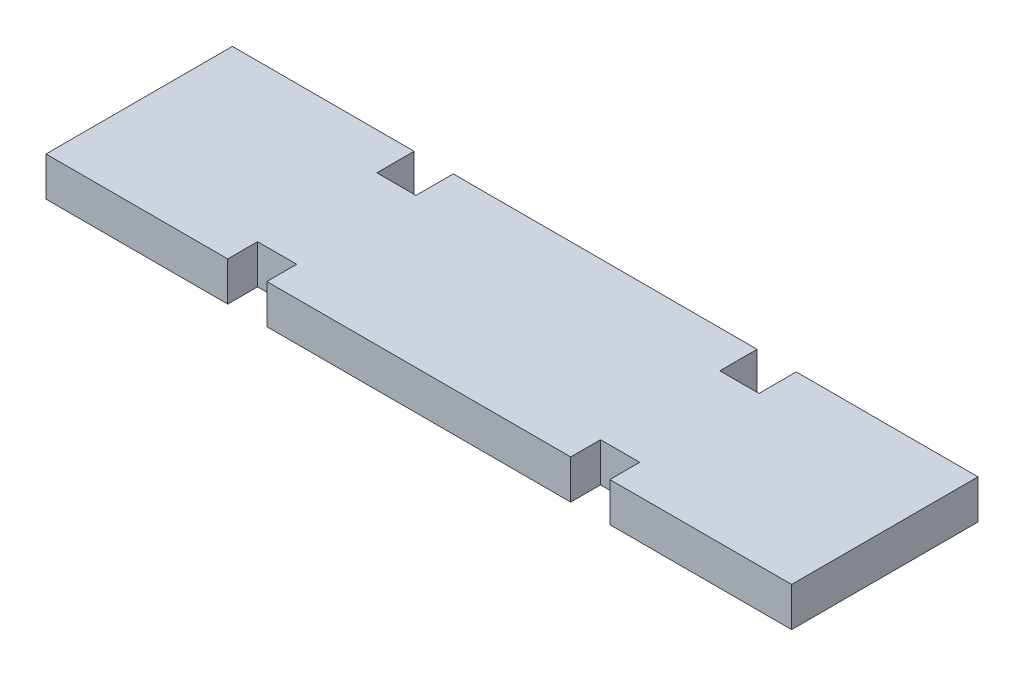
ISO-10303-21;
HEADER;
FILE_DESCRIPTION(('STEP AP214'),'2;1');
FILE_NAME('part.step','',(''),(''),'','','');
FILE_SCHEMA(('AUTOMOTIVE_DESIGN { 1 0 10303 214 1 1 1 1 }'));
ENDSEC;
DATA;
#1=APPLICATION_CONTEXT('core data for automotive mechanical design processes');
#2=APPLICATION_PROTOCOL_DEFINITION('international standard','automotive_design',2000,#1);
#3=PRODUCT_CONTEXT('',#1,'mechanical');
#4=PRODUCT('Part','Part','',(#3));
#5=PRODUCT_RELATED_PRODUCT_CATEGORY('part','',(#4));
#6=PRODUCT_DEFINITION_FORMATION('','',#4);
#7=PRODUCT_DEFINITION_CONTEXT('part definition',#1,'design');
#8=PRODUCT_DEFINITION('design','',#6,#7);
#9=PRODUCT_DEFINITION_SHAPE('','',#8);
#10=(LENGTH_UNIT() NAMED_UNIT(*) SI_UNIT(.MILLI.,.METRE.));
#11=(NAMED_UNIT(*) PLANE_ANGLE_UNIT() SI_UNIT($,.RADIAN.));
#12=(NAMED_UNIT(*) SI_UNIT($,.STERADIAN.) SOLID_ANGLE_UNIT());
#13=UNCERTAINTY_MEASURE_WITH_UNIT(LENGTH_MEASURE(1.E-05),#10,'distance_accuracy_value','');
#14=(GEOMETRIC_REPRESENTATION_CONTEXT(3) GLOBAL_UNCERTAINTY_ASSIGNED_CONTEXT((#13)) GLOBAL_UNIT_ASSIGNED_CONTEXT((#10,
#11,#12)) REPRESENTATION_CONTEXT('',''));
#15=CARTESIAN_POINT('',(0.,0.,0.));
#16=DIRECTION('',(0.,0.,1.));
#17=DIRECTION('',(1.,0.,0.));
#18=AXIS2_PLACEMENT_3D('',#15,#16,#17);
#19=CARTESIAN_POINT('',(-61.4443732272423,5.334,-32.8730043975415));
#20=DIRECTION('',(0.,0.,1.));
#21=DIRECTION('',(1.,0.,0.));
#22=AXIS2_PLACEMENT_3D('',#19,#20,#21);
#23=PLANE('',#22);
#24=DIRECTION('',(-1.,0.,0.));
#25=VECTOR('',#24,1.);
#26=CARTESIAN_POINT('',(-61.4443732272423,0.,-32.8730043975415));
#27=LINE('',#26,#25);
#28=CARTESIAN_POINT('',(10.0566267727577,0.,-32.8730043975415));
#29=VERTEX_POINT('',#28);
#30=CARTESIAN_POINT('',(-31.3453732272423,0.,-32.8730043975415));
#31=VERTEX_POINT('',#30);
#32=EDGE_CURVE('E193',#29,#31,#27,.T.);
#33=ORIENTED_EDGE('',*,*,#32,.T.);
#34=DIRECTION('',(0.,1.,0.));
#35=VECTOR('',#34,1.);
#36=CARTESIAN_POINT('',(-31.3453732272423,0.,-32.8730043975415));
#37=LINE('',#36,#35);
#38=CARTESIAN_POINT('',(-31.3453732272423,5.334,-32.8730043975415));
#39=VERTEX_POINT('',#38);
#40=EDGE_CURVE('E344',#31,#39,#37,.T.);
#41=ORIENTED_EDGE('',*,*,#40,.T.);
#42=DIRECTION('',(-1.,0.,0.));
#43=VECTOR('',#42,1.);
#44=CARTESIAN_POINT('',(-61.4443732272423,5.334,-32.8730043975415));
#45=LINE('',#44,#43);
#46=CARTESIAN_POINT('',(10.0566267727577,5.334,-32.8730043975415));
#47=VERTEX_POINT('',#46);
#48=EDGE_CURVE('E227',#47,#39,#45,.T.);
#49=ORIENTED_EDGE('',*,*,#48,.F.);
#50=DIRECTION('',(0.,1.,0.));
#51=VECTOR('',#50,1.);
#52=CARTESIAN_POINT('',(10.0566267727577,0.,-32.8730043975415));
#53=LINE('',#52,#51);
#54=EDGE_CURVE('E230',#29,#47,#53,.T.);
#55=ORIENTED_EDGE('',*,*,#54,.F.);
#56=EDGE_LOOP('',(#33,#41,#49,#55));
#57=FACE_BOUND('',#56,.T.);
#58=ADVANCED_FACE('F33',(#57),#23,.F.);
#59=CARTESIAN_POINT('',(-61.4443732272423,5.334,-7.4730043975415));
#60=DIRECTION('',(0.,0.,-1.));
#61=DIRECTION('',(-1.,0.,0.));
#62=AXIS2_PLACEMENT_3D('',#59,#60,#61);
#63=PLANE('',#62);
#64=DIRECTION('',(1.,0.,0.));
#65=VECTOR('',#64,1.);
#66=CARTESIAN_POINT('',(-61.4443732272423,0.,-7.4730043975415));
#67=LINE('',#66,#65);
#68=CARTESIAN_POINT('',(-61.4443732272423,0.,-7.4730043975415));
#69=VERTEX_POINT('',#68);
#70=CARTESIAN_POINT('',(-36.6793732272423,0.,-7.4730043975415));
#71=VERTEX_POINT('',#70);
#72=EDGE_CURVE('E198',#69,#71,#67,.T.);
#73=ORIENTED_EDGE('',*,*,#72,.T.);
#74=DIRECTION('',(0.,1.,0.));
#75=VECTOR('',#74,1.);
#76=CARTESIAN_POINT('',(-36.6793732272423,0.,-7.4730043975415));
#77=LINE('',#76,#75);
#78=CARTESIAN_POINT('',(-36.6793732272423,5.334,-7.4730043975415));
#79=VERTEX_POINT('',#78);
#80=EDGE_CURVE('E288',#71,#79,#77,.T.);
#81=ORIENTED_EDGE('',*,*,#80,.T.);
#82=DIRECTION('',(1.,0.,0.));
#83=VECTOR('',#82,1.);
#84=CARTESIAN_POINT('',(-61.4443732272423,5.334,-7.4730043975415));
#85=LINE('',#84,#83);
#86=CARTESIAN_POINT('',(-61.4443732272423,5.334,-7.4730043975415));
#87=VERTEX_POINT('',#86);
#88=EDGE_CURVE('E216',#87,#79,#85,.T.);
#89=ORIENTED_EDGE('',*,*,#88,.F.);
#90=DIRECTION('',(0.,-1.,0.));
#91=VECTOR('',#90,1.);
#92=CARTESIAN_POINT('',(-61.4443732272423,5.334,-7.4730043975415));
#93=LINE('',#92,#91);
#94=EDGE_CURVE('E11',#87,#69,#93,.T.);
#95=ORIENTED_EDGE('',*,*,#94,.T.);
#96=EDGE_LOOP('',(#73,#81,#89,#95));
#97=FACE_BOUND('',#96,.T.);
#98=ADVANCED_FACE('F287',(#97),#63,.F.);
#99=CARTESIAN_POINT('',(-31.3453732272423,5.334,-7.4730043975415));
#100=VERTEX_POINT('',#99);
#101=CARTESIAN_POINT('',(10.0566267727577,5.334,-7.4730043975415));
#102=VERTEX_POINT('',#101);
#103=EDGE_CURVE('E214',#100,#102,#85,.T.);
#104=ORIENTED_EDGE('',*,*,#103,.F.);
#105=DIRECTION('',(0.,1.,0.));
#106=VECTOR('',#105,1.);
#107=CARTESIAN_POINT('',(-31.3453732272423,0.,-7.4730043975415));
#108=LINE('',#107,#106);
#109=CARTESIAN_POINT('',(-31.3453732272423,0.,-7.4730043975415));
#110=VERTEX_POINT('',#109);
#111=EDGE_CURVE('E310',#110,#100,#108,.T.);
#112=ORIENTED_EDGE('',*,*,#111,.F.);
#113=CARTESIAN_POINT('',(10.0566267727577,0.,-7.4730043975415));
#114=VERTEX_POINT('',#113);
#115=EDGE_CURVE('E232',#110,#114,#67,.T.);
#116=ORIENTED_EDGE('',*,*,#115,.T.);
#117=DIRECTION('',(0.,1.,0.));
#118=VECTOR('',#117,1.);
#119=CARTESIAN_POINT('',(10.0566267727577,0.,-7.4730043975415));
#120=LINE('',#119,#118);
#121=EDGE_CURVE('E322',#114,#102,#120,.T.);
#122=ORIENTED_EDGE('',*,*,#121,.T.);
#123=EDGE_LOOP('',(#104,#112,#116,#122));
#124=FACE_BOUND('',#123,.T.);
#125=ADVANCED_FACE('F368',(#124),#63,.F.);
#126=CARTESIAN_POINT('',(-36.6793732272423,5.334,-32.8730043975415));
#127=VERTEX_POINT('',#126);
#128=CARTESIAN_POINT('',(-61.4443732272423,5.334,-32.8730043975415));
#129=VERTEX_POINT('',#128);
#130=EDGE_CURVE('E186',#127,#129,#45,.T.);
#131=ORIENTED_EDGE('',*,*,#130,.F.);
#132=DIRECTION('',(0.,1.,0.));
#133=VECTOR('',#132,1.);
#134=CARTESIAN_POINT('',(-36.6793732272423,0.,-32.8730043975415));
#135=LINE('',#134,#133);
#136=CARTESIAN_POINT('',(-36.6793732272423,0.,-32.8730043975415));
#137=VERTEX_POINT('',#136);
#138=EDGE_CURVE('E173',#137,#127,#135,.T.);
#139=ORIENTED_EDGE('',*,*,#138,.F.);
#140=CARTESIAN_POINT('',(-61.4443732272423,0.,-32.8730043975415));
#141=VERTEX_POINT('',#140);
#142=EDGE_CURVE('E184',#137,#141,#27,.T.);
#143=ORIENTED_EDGE('',*,*,#142,.T.);
#144=DIRECTION('',(0.,-1.,0.));
#145=VECTOR('',#144,1.);
#146=CARTESIAN_POINT('',(-61.4443732272423,5.334,-32.8730043975415));
#147=LINE('',#146,#145);
#148=EDGE_CURVE('E226',#129,#141,#147,.T.);
#149=ORIENTED_EDGE('',*,*,#148,.F.);
#150=EDGE_LOOP('',(#131,#139,#143,#149));
#151=FACE_BOUND('',#150,.T.);
#152=ADVANCED_FACE('F182',(#151),#23,.F.);
#153=CARTESIAN_POINT('',(-61.4443732272423,5.334,-32.8730043975415));
#154=DIRECTION('',(1.,0.,0.));
#155=DIRECTION('',(0.,0.,-1.));
#156=AXIS2_PLACEMENT_3D('',#153,#154,#155);
#157=PLANE('',#156);
#158=DIRECTION('',(0.,0.,1.));
#159=VECTOR('',#158,1.);
#160=CARTESIAN_POINT('',(-61.4443732272423,0.,-32.8730043975415));
#161=LINE('',#160,#159);
#162=EDGE_CURVE('E192',#141,#69,#161,.T.);
#163=ORIENTED_EDGE('',*,*,#162,.T.);
#164=ORIENTED_EDGE('',*,*,#94,.F.);
#165=DIRECTION('',(0.,0.,1.));
#166=VECTOR('',#165,1.);
#167=CARTESIAN_POINT('',(-61.4443732272423,5.334,-32.8730043975415));
#168=LINE('',#167,#166);
#169=EDGE_CURVE('E202',#129,#87,#168,.T.);
#170=ORIENTED_EDGE('',*,*,#169,.F.);
#171=ORIENTED_EDGE('',*,*,#148,.T.);
#172=EDGE_LOOP('',(#163,#164,#170,#171));
#173=FACE_BOUND('',#172,.T.);
#174=ADVANCED_FACE('F35',(#173),#157,.F.);
#175=CARTESIAN_POINT('',(15.3906267727577,5.334,-7.4730043975415));
#176=VERTEX_POINT('',#175);
#177=CARTESIAN_POINT('',(40.1556267727577,5.334,-7.4730043975415));
#178=VERTEX_POINT('',#177);
#179=EDGE_CURVE('E208',#176,#178,#85,.T.);
#180=ORIENTED_EDGE('',*,*,#179,.F.);
#181=DIRECTION('',(0.,1.,0.));
#182=VECTOR('',#181,1.);
#183=CARTESIAN_POINT('',(15.3906267727577,0.,-7.4730043975415));
#184=LINE('',#183,#182);
#185=CARTESIAN_POINT('',(15.3906267727577,0.,-7.4730043975415));
#186=VERTEX_POINT('',#185);
#187=EDGE_CURVE('E243',#186,#176,#184,.T.);
#188=ORIENTED_EDGE('',*,*,#187,.F.);
#189=CARTESIAN_POINT('',(40.1556267727577,0.,-7.4730043975415));
#190=VERTEX_POINT('',#189);
#191=EDGE_CURVE('E229',#186,#190,#67,.T.);
#192=ORIENTED_EDGE('',*,*,#191,.T.);
#193=DIRECTION('',(0.,-1.,0.));
#194=VECTOR('',#193,1.);
#195=CARTESIAN_POINT('',(40.1556267727577,5.334,-7.4730043975415));
#196=LINE('',#195,#194);
#197=EDGE_CURVE('E41',#178,#190,#196,.T.);
#198=ORIENTED_EDGE('',*,*,#197,.F.);
#199=EDGE_LOOP('',(#180,#188,#192,#198));
#200=FACE_BOUND('',#199,.T.);
#201=ADVANCED_FACE('F241',(#200),#63,.F.);
#202=CARTESIAN_POINT('',(40.1556267727577,5.334,-32.8730043975415));
#203=DIRECTION('',(-1.,0.,0.));
#204=DIRECTION('',(0.,0.,1.));
#205=AXIS2_PLACEMENT_3D('',#202,#203,#204);
#206=PLANE('',#205);
#207=DIRECTION('',(0.,0.,-1.));
#208=VECTOR('',#207,1.);
#209=CARTESIAN_POINT('',(40.1556267727577,0.,-32.8730043975415));
#210=LINE('',#209,#208);
#211=CARTESIAN_POINT('',(40.1556267727577,0.,-32.8730043975415));
#212=VERTEX_POINT('',#211);
#213=EDGE_CURVE('E194',#190,#212,#210,.T.);
#214=ORIENTED_EDGE('',*,*,#213,.T.);
#215=DIRECTION('',(0.,-1.,0.));
#216=VECTOR('',#215,1.);
#217=CARTESIAN_POINT('',(40.1556267727577,5.334,-32.8730043975415));
#218=LINE('',#217,#216);
#219=CARTESIAN_POINT('',(40.1556267727577,5.334,-32.8730043975415));
#220=VERTEX_POINT('',#219);
#221=EDGE_CURVE('E249',#220,#212,#218,.T.);
#222=ORIENTED_EDGE('',*,*,#221,.F.);
#223=DIRECTION('',(0.,0.,-1.));
#224=VECTOR('',#223,1.);
#225=CARTESIAN_POINT('',(40.1556267727577,5.334,-32.8730043975415));
#226=LINE('',#225,#224);
#227=EDGE_CURVE('E221',#178,#220,#226,.T.);
#228=ORIENTED_EDGE('',*,*,#227,.F.);
#229=ORIENTED_EDGE('',*,*,#197,.T.);
#230=EDGE_LOOP('',(#214,#222,#228,#229));
#231=FACE_BOUND('',#230,.T.);
#232=ADVANCED_FACE('F247',(#231),#206,.F.);
#233=CARTESIAN_POINT('',(15.3906267727577,0.,-32.8730043975415));
#234=VERTEX_POINT('',#233);
#235=EDGE_CURVE('E196',#212,#234,#27,.T.);
#236=ORIENTED_EDGE('',*,*,#235,.T.);
#237=DIRECTION('',(0.,1.,0.));
#238=VECTOR('',#237,1.);
#239=CARTESIAN_POINT('',(15.3906267727577,0.,-32.8730043975415));
#240=LINE('',#239,#238);
#241=CARTESIAN_POINT('',(15.3906267727577,5.334,-32.8730043975415));
#242=VERTEX_POINT('',#241);
#243=EDGE_CURVE('E274',#234,#242,#240,.T.);
#244=ORIENTED_EDGE('',*,*,#243,.T.);
#245=EDGE_CURVE('E223',#220,#242,#45,.T.);
#246=ORIENTED_EDGE('',*,*,#245,.F.);
#247=ORIENTED_EDGE('',*,*,#221,.T.);
#248=EDGE_LOOP('',(#236,#244,#246,#247));
#249=FACE_BOUND('',#248,.T.);
#250=ADVANCED_FACE('F284',(#249),#23,.F.);
#251=CARTESIAN_POINT('',(0.,5.334,0.));
#252=DIRECTION('',(0.,1.,0.));
#253=DIRECTION('',(0.,0.,1.));
#254=AXIS2_PLACEMENT_3D('',#251,#252,#253);
#255=PLANE('',#254);
#256=DIRECTION('',(0.,0.,-1.));
#257=VECTOR('',#256,1.);
#258=CARTESIAN_POINT('',(-31.3453732272423,5.334,-32.8730043975415));
#259=LINE('',#258,#257);
#260=CARTESIAN_POINT('',(-31.3453732272423,5.334,-27.7930043975415));
#261=VERTEX_POINT('',#260);
#262=EDGE_CURVE('E178',#261,#39,#259,.T.);
#263=ORIENTED_EDGE('',*,*,#262,.F.);
#264=DIRECTION('',(1.,0.,0.));
#265=VECTOR('',#264,1.);
#266=CARTESIAN_POINT('',(-31.3453732272423,5.334,-27.7930043975415));
#267=LINE('',#266,#265);
#268=CARTESIAN_POINT('',(-36.6793732272423,5.334,-27.7930043975415));
#269=VERTEX_POINT('',#268);
#270=EDGE_CURVE('E348',#269,#261,#267,.T.);
#271=ORIENTED_EDGE('',*,*,#270,.F.);
#272=DIRECTION('',(0.,0.,1.));
#273=VECTOR('',#272,1.);
#274=CARTESIAN_POINT('',(-36.6793732272423,5.334,-32.8730043975415));
#275=LINE('',#274,#273);
#276=EDGE_CURVE('E346',#127,#269,#275,.T.);
#277=ORIENTED_EDGE('',*,*,#276,.F.);
#278=ORIENTED_EDGE('',*,*,#130,.T.);
#279=ORIENTED_EDGE('',*,*,#169,.T.);
#280=ORIENTED_EDGE('',*,*,#88,.T.);
#281=DIRECTION('',(0.,0.,1.));
#282=VECTOR('',#281,1.);
#283=CARTESIAN_POINT('',(-36.6793732272423,5.334,-7.4730043975415));
#284=LINE('',#283,#282);
#285=CARTESIAN_POINT('',(-36.6793732272423,5.334,-11.5370043975415));
#286=VERTEX_POINT('',#285);
#287=EDGE_CURVE('E291',#286,#79,#284,.T.);
#288=ORIENTED_EDGE('',*,*,#287,.F.);
#289=DIRECTION('',(-1.,0.,0.));
#290=VECTOR('',#289,1.);
#291=CARTESIAN_POINT('',(-31.3453732272423,5.334,-11.5370043975415));
#292=LINE('',#291,#290);
#293=CARTESIAN_POINT('',(-31.3453732272423,5.334,-11.5370043975415));
#294=VERTEX_POINT('',#293);
#295=EDGE_CURVE('E294',#294,#286,#292,.T.);
#296=ORIENTED_EDGE('',*,*,#295,.F.);
#297=DIRECTION('',(0.,0.,-1.));
#298=VECTOR('',#297,1.);
#299=CARTESIAN_POINT('',(-31.3453732272423,5.334,-7.4730043975415));
#300=LINE('',#299,#298);
#301=EDGE_CURVE('E300',#100,#294,#300,.T.);
#302=ORIENTED_EDGE('',*,*,#301,.F.);
#303=ORIENTED_EDGE('',*,*,#103,.T.);
#304=DIRECTION('',(0.,0.,1.));
#305=VECTOR('',#304,1.);
#306=CARTESIAN_POINT('',(10.0566267727577,5.334,-7.4730043975415));
#307=LINE('',#306,#305);
#308=CARTESIAN_POINT('',(10.0566267727577,5.334,-11.5370043975415));
#309=VERTEX_POINT('',#308);
#310=EDGE_CURVE('E305',#309,#102,#307,.T.);
#311=ORIENTED_EDGE('',*,*,#310,.F.);
#312=DIRECTION('',(-1.,0.,0.));
#313=VECTOR('',#312,1.);
#314=CARTESIAN_POINT('',(10.0566267727577,5.334,-11.5370043975415));
#315=LINE('',#314,#313);
#316=CARTESIAN_POINT('',(15.3906267727577,5.334,-11.5370043975415));
#317=VERTEX_POINT('',#316);
#318=EDGE_CURVE('E317',#317,#309,#315,.T.);
#319=ORIENTED_EDGE('',*,*,#318,.F.);
#320=DIRECTION('',(0.,0.,-1.));
#321=VECTOR('',#320,1.);
#322=CARTESIAN_POINT('',(15.3906267727577,5.334,-7.4730043975415));
#323=LINE('',#322,#321);
#324=EDGE_CURVE('E325',#176,#317,#323,.T.);
#325=ORIENTED_EDGE('',*,*,#324,.F.);
#326=ORIENTED_EDGE('',*,*,#179,.T.);
#327=ORIENTED_EDGE('',*,*,#227,.T.);
#328=ORIENTED_EDGE('',*,*,#245,.T.);
#329=DIRECTION('',(0.,0.,-1.));
#330=VECTOR('',#329,1.);
#331=CARTESIAN_POINT('',(15.3906267727577,5.334,-32.8730043975415));
#332=LINE('',#331,#330);
#333=CARTESIAN_POINT('',(15.3906267727577,5.334,-27.7930043975415));
#334=VERTEX_POINT('',#333);
#335=EDGE_CURVE('E271',#334,#242,#332,.T.);
#336=ORIENTED_EDGE('',*,*,#335,.F.);
#337=DIRECTION('',(1.,0.,0.));
#338=VECTOR('',#337,1.);
#339=CARTESIAN_POINT('',(10.0566267727577,5.334,-27.7930043975415));
#340=LINE('',#339,#338);
#341=CARTESIAN_POINT('',(10.0566267727577,5.334,-27.7930043975415));
#342=VERTEX_POINT('',#341);
#343=EDGE_CURVE('E267',#342,#334,#340,.T.);
#344=ORIENTED_EDGE('',*,*,#343,.F.);
#345=DIRECTION('',(0.,0.,1.));
#346=VECTOR('',#345,1.);
#347=CARTESIAN_POINT('',(10.0566267727577,5.334,-32.8730043975415));
#348=LINE('',#347,#346);
#349=EDGE_CURVE('E264',#47,#342,#348,.T.);
#350=ORIENTED_EDGE('',*,*,#349,.F.);
#351=ORIENTED_EDGE('',*,*,#48,.T.);
#352=EDGE_LOOP('',(#263,#271,#277,#278,#279,#280,#288,#296,#302,#303,#311,#319,#325,#326,#327,
#328,#336,#344,#350,#351));
#353=FACE_BOUND('',#352,.T.);
#354=ADVANCED_FACE('F282',(#353),#255,.T.);
#355=CARTESIAN_POINT('',(0.,0.,0.));
#356=DIRECTION('',(0.,1.,0.));
#357=DIRECTION('',(0.,0.,1.));
#358=AXIS2_PLACEMENT_3D('',#355,#356,#357);
#359=PLANE('',#358);
#360=DIRECTION('',(1.,0.,0.));
#361=VECTOR('',#360,1.);
#362=CARTESIAN_POINT('',(-31.3453732272423,0.,-27.7930043975415));
#363=LINE('',#362,#361);
#364=CARTESIAN_POINT('',(-36.6793732272423,0.,-27.7930043975415));
#365=VERTEX_POINT('',#364);
#366=CARTESIAN_POINT('',(-31.3453732272423,0.,-27.7930043975415));
#367=VERTEX_POINT('',#366);
#368=EDGE_CURVE('E48',#365,#367,#363,.T.);
#369=ORIENTED_EDGE('',*,*,#368,.T.);
#370=DIRECTION('',(0.,0.,-1.));
#371=VECTOR('',#370,1.);
#372=CARTESIAN_POINT('',(-31.3453732272423,0.,-32.8730043975415));
#373=LINE('',#372,#371);
#374=EDGE_CURVE('E187',#367,#31,#373,.T.);
#375=ORIENTED_EDGE('',*,*,#374,.T.);
#376=ORIENTED_EDGE('',*,*,#32,.F.);
#377=DIRECTION('',(0.,0.,1.));
#378=VECTOR('',#377,1.);
#379=CARTESIAN_POINT('',(10.0566267727577,0.,-32.8730043975415));
#380=LINE('',#379,#378);
#381=CARTESIAN_POINT('',(10.0566267727577,0.,-27.7930043975415));
#382=VERTEX_POINT('',#381);
#383=EDGE_CURVE('E260',#29,#382,#380,.T.);
#384=ORIENTED_EDGE('',*,*,#383,.T.);
#385=DIRECTION('',(1.,0.,0.));
#386=VECTOR('',#385,1.);
#387=CARTESIAN_POINT('',(10.0566267727577,0.,-27.7930043975415));
#388=LINE('',#387,#386);
#389=CARTESIAN_POINT('',(15.3906267727577,0.,-27.7930043975415));
#390=VERTEX_POINT('',#389);
#391=EDGE_CURVE('E255',#382,#390,#388,.T.);
#392=ORIENTED_EDGE('',*,*,#391,.T.);
#393=DIRECTION('',(0.,0.,-1.));
#394=VECTOR('',#393,1.);
#395=CARTESIAN_POINT('',(15.3906267727577,0.,-32.8730043975415));
#396=LINE('',#395,#394);
#397=EDGE_CURVE('E252',#390,#234,#396,.T.);
#398=ORIENTED_EDGE('',*,*,#397,.T.);
#399=ORIENTED_EDGE('',*,*,#235,.F.);
#400=ORIENTED_EDGE('',*,*,#213,.F.);
#401=ORIENTED_EDGE('',*,*,#191,.F.);
#402=DIRECTION('',(0.,0.,-1.));
#403=VECTOR('',#402,1.);
#404=CARTESIAN_POINT('',(15.3906267727577,0.,-7.4730043975415));
#405=LINE('',#404,#403);
#406=CARTESIAN_POINT('',(15.3906267727577,0.,-11.5370043975415));
#407=VERTEX_POINT('',#406);
#408=EDGE_CURVE('E316',#186,#407,#405,.T.);
#409=ORIENTED_EDGE('',*,*,#408,.T.);
#410=DIRECTION('',(-1.,0.,0.));
#411=VECTOR('',#410,1.);
#412=CARTESIAN_POINT('',(10.0566267727577,0.,-11.5370043975415));
#413=LINE('',#412,#411);
#414=CARTESIAN_POINT('',(10.0566267727577,0.,-11.5370043975415));
#415=VERTEX_POINT('',#414);
#416=EDGE_CURVE('E319',#407,#415,#413,.T.);
#417=ORIENTED_EDGE('',*,*,#416,.T.);
#418=DIRECTION('',(0.,0.,1.));
#419=VECTOR('',#418,1.);
#420=CARTESIAN_POINT('',(10.0566267727577,0.,-7.4730043975415));
#421=LINE('',#420,#419);
#422=EDGE_CURVE('E313',#415,#114,#421,.T.);
#423=ORIENTED_EDGE('',*,*,#422,.T.);
#424=ORIENTED_EDGE('',*,*,#115,.F.);
#425=DIRECTION('',(0.,0.,-1.));
#426=VECTOR('',#425,1.);
#427=CARTESIAN_POINT('',(-31.3453732272423,0.,-7.4730043975415));
#428=LINE('',#427,#426);
#429=CARTESIAN_POINT('',(-31.3453732272423,0.,-11.5370043975415));
#430=VERTEX_POINT('',#429);
#431=EDGE_CURVE('E296',#110,#430,#428,.T.);
#432=ORIENTED_EDGE('',*,*,#431,.T.);
#433=DIRECTION('',(-1.,0.,0.));
#434=VECTOR('',#433,1.);
#435=CARTESIAN_POINT('',(-31.3453732272423,0.,-11.5370043975415));
#436=LINE('',#435,#434);
#437=CARTESIAN_POINT('',(-36.6793732272423,0.,-11.5370043975415));
#438=VERTEX_POINT('',#437);
#439=EDGE_CURVE('E56',#430,#438,#436,.T.);
#440=ORIENTED_EDGE('',*,*,#439,.T.);
#441=DIRECTION('',(0.,0.,1.));
#442=VECTOR('',#441,1.);
#443=CARTESIAN_POINT('',(-36.6793732272423,0.,-7.4730043975415));
#444=LINE('',#443,#442);
#445=EDGE_CURVE('E312',#438,#71,#444,.T.);
#446=ORIENTED_EDGE('',*,*,#445,.T.);
#447=ORIENTED_EDGE('',*,*,#72,.F.);
#448=ORIENTED_EDGE('',*,*,#162,.F.);
#449=ORIENTED_EDGE('',*,*,#142,.F.);
#450=DIRECTION('',(0.,0.,1.));
#451=VECTOR('',#450,1.);
#452=CARTESIAN_POINT('',(-36.6793732272423,0.,-32.8730043975415));
#453=LINE('',#452,#451);
#454=EDGE_CURVE('E169',#137,#365,#453,.T.);
#455=ORIENTED_EDGE('',*,*,#454,.T.);
#456=EDGE_LOOP('',(#369,#375,#376,#384,#392,#398,#399,#400,#401,#409,#417,#423,#424,#432,#440,
#446,#447,#448,#449,#455));
#457=FACE_BOUND('',#456,.T.);
#458=ADVANCED_FACE('F190',(#457),#359,.F.);
#459=CARTESIAN_POINT('',(10.0566267727577,0.,-32.8730043975415));
#460=DIRECTION('',(-1.,0.,0.));
#461=DIRECTION('',(0.,0.,1.));
#462=AXIS2_PLACEMENT_3D('',#459,#460,#461);
#463=PLANE('',#462);
#464=ORIENTED_EDGE('',*,*,#349,.T.);
#465=DIRECTION('',(0.,1.,0.));
#466=VECTOR('',#465,1.);
#467=CARTESIAN_POINT('',(10.0566267727577,0.,-27.7930043975415));
#468=LINE('',#467,#466);
#469=EDGE_CURVE('E218',#382,#342,#468,.T.);
#470=ORIENTED_EDGE('',*,*,#469,.F.);
#471=ORIENTED_EDGE('',*,*,#383,.F.);
#472=ORIENTED_EDGE('',*,*,#54,.T.);
#473=EDGE_LOOP('',(#464,#470,#471,#472));
#474=FACE_BOUND('',#473,.T.);
#475=ADVANCED_FACE('F339',(#474),#463,.F.);
#476=CARTESIAN_POINT('',(15.3906267727577,0.,-32.8730043975415));
#477=DIRECTION('',(1.,0.,0.));
#478=DIRECTION('',(0.,0.,-1.));
#479=AXIS2_PLACEMENT_3D('',#476,#477,#478);
#480=PLANE('',#479);
#481=ORIENTED_EDGE('',*,*,#335,.T.);
#482=ORIENTED_EDGE('',*,*,#243,.F.);
#483=ORIENTED_EDGE('',*,*,#397,.F.);
#484=DIRECTION('',(0.,1.,0.));
#485=VECTOR('',#484,1.);
#486=CARTESIAN_POINT('',(15.3906267727577,0.,-27.7930043975415));
#487=LINE('',#486,#485);
#488=EDGE_CURVE('E259',#390,#334,#487,.T.);
#489=ORIENTED_EDGE('',*,*,#488,.T.);
#490=EDGE_LOOP('',(#481,#482,#483,#489));
#491=FACE_BOUND('',#490,.T.);
#492=ADVANCED_FACE('F275',(#491),#480,.F.);
#493=CARTESIAN_POINT('',(10.0566267727577,0.,-27.7930043975415));
#494=DIRECTION('',(0.,0.,1.));
#495=DIRECTION('',(1.,0.,0.));
#496=AXIS2_PLACEMENT_3D('',#493,#494,#495);
#497=PLANE('',#496);
#498=ORIENTED_EDGE('',*,*,#343,.T.);
#499=ORIENTED_EDGE('',*,*,#488,.F.);
#500=ORIENTED_EDGE('',*,*,#391,.F.);
#501=ORIENTED_EDGE('',*,*,#469,.T.);
#502=EDGE_LOOP('',(#498,#499,#500,#501));
#503=FACE_BOUND('',#502,.T.);
#504=ADVANCED_FACE('F279',(#503),#497,.F.);
#505=CARTESIAN_POINT('',(10.0566267727577,0.,-7.4730043975415));
#506=DIRECTION('',(-1.,0.,0.));
#507=DIRECTION('',(0.,0.,1.));
#508=AXIS2_PLACEMENT_3D('',#505,#506,#507);
#509=PLANE('',#508);
#510=ORIENTED_EDGE('',*,*,#310,.T.);
#511=ORIENTED_EDGE('',*,*,#121,.F.);
#512=ORIENTED_EDGE('',*,*,#422,.F.);
#513=DIRECTION('',(0.,1.,0.));
#514=VECTOR('',#513,1.);
#515=CARTESIAN_POINT('',(10.0566267727577,0.,-11.5370043975415));
#516=LINE('',#515,#514);
#517=EDGE_CURVE('E268',#415,#309,#516,.T.);
#518=ORIENTED_EDGE('',*,*,#517,.T.);
#519=EDGE_LOOP('',(#510,#511,#512,#518));
#520=FACE_BOUND('',#519,.T.);
#521=ADVANCED_FACE('F373',(#520),#509,.F.);
#522=CARTESIAN_POINT('',(10.0566267727577,0.,-11.5370043975415));
#523=DIRECTION('',(0.,0.,-1.));
#524=DIRECTION('',(-1.,0.,0.));
#525=AXIS2_PLACEMENT_3D('',#522,#523,#524);
#526=PLANE('',#525);
#527=ORIENTED_EDGE('',*,*,#318,.T.);
#528=ORIENTED_EDGE('',*,*,#517,.F.);
#529=ORIENTED_EDGE('',*,*,#416,.F.);
#530=DIRECTION('',(0.,1.,0.));
#531=VECTOR('',#530,1.);
#532=CARTESIAN_POINT('',(15.3906267727577,0.,-11.5370043975415));
#533=LINE('',#532,#531);
#534=EDGE_CURVE('E331',#407,#317,#533,.T.);
#535=ORIENTED_EDGE('',*,*,#534,.T.);
#536=EDGE_LOOP('',(#527,#528,#529,#535));
#537=FACE_BOUND('',#536,.T.);
#538=ADVANCED_FACE('F376',(#537),#526,.F.);
#539=CARTESIAN_POINT('',(15.3906267727577,0.,-7.4730043975415));
#540=DIRECTION('',(1.,0.,0.));
#541=DIRECTION('',(0.,0.,-1.));
#542=AXIS2_PLACEMENT_3D('',#539,#540,#541);
#543=PLANE('',#542);
#544=ORIENTED_EDGE('',*,*,#324,.T.);
#545=ORIENTED_EDGE('',*,*,#534,.F.);
#546=ORIENTED_EDGE('',*,*,#408,.F.);
#547=ORIENTED_EDGE('',*,*,#187,.T.);
#548=EDGE_LOOP('',(#544,#545,#546,#547));
#549=FACE_BOUND('',#548,.T.);
#550=ADVANCED_FACE('F378',(#549),#543,.F.);
#551=CARTESIAN_POINT('',(-36.6793732272423,0.,-7.4730043975415));
#552=DIRECTION('',(-1.,0.,0.));
#553=DIRECTION('',(0.,0.,1.));
#554=AXIS2_PLACEMENT_3D('',#551,#552,#553);
#555=PLANE('',#554);
#556=ORIENTED_EDGE('',*,*,#287,.T.);
#557=ORIENTED_EDGE('',*,*,#80,.F.);
#558=ORIENTED_EDGE('',*,*,#445,.F.);
#559=DIRECTION('',(0.,1.,0.));
#560=VECTOR('',#559,1.);
#561=CARTESIAN_POINT('',(-36.6793732272423,0.,-11.5370043975415));
#562=LINE('',#561,#560);
#563=EDGE_CURVE('E306',#438,#286,#562,.T.);
#564=ORIENTED_EDGE('',*,*,#563,.T.);
#565=EDGE_LOOP('',(#556,#557,#558,#564));
#566=FACE_BOUND('',#565,.T.);
#567=ADVANCED_FACE('F382',(#566),#555,.F.);
#568=CARTESIAN_POINT('',(-31.3453732272423,0.,-11.5370043975415));
#569=DIRECTION('',(0.,0.,-1.));
#570=DIRECTION('',(-1.,0.,0.));
#571=AXIS2_PLACEMENT_3D('',#568,#569,#570);
#572=PLANE('',#571);
#573=ORIENTED_EDGE('',*,*,#295,.T.);
#574=ORIENTED_EDGE('',*,*,#563,.F.);
#575=ORIENTED_EDGE('',*,*,#439,.F.);
#576=DIRECTION('',(0.,1.,0.));
#577=VECTOR('',#576,1.);
#578=CARTESIAN_POINT('',(-31.3453732272423,0.,-11.5370043975415));
#579=LINE('',#578,#577);
#580=EDGE_CURVE('E308',#430,#294,#579,.T.);
#581=ORIENTED_EDGE('',*,*,#580,.T.);
#582=EDGE_LOOP('',(#573,#574,#575,#581));
#583=FACE_BOUND('',#582,.T.);
#584=ADVANCED_FACE('F388',(#583),#572,.F.);
#585=CARTESIAN_POINT('',(-31.3453732272423,0.,-7.4730043975415));
#586=DIRECTION('',(1.,0.,0.));
#587=DIRECTION('',(0.,0.,-1.));
#588=AXIS2_PLACEMENT_3D('',#585,#586,#587);
#589=PLANE('',#588);
#590=ORIENTED_EDGE('',*,*,#301,.T.);
#591=ORIENTED_EDGE('',*,*,#580,.F.);
#592=ORIENTED_EDGE('',*,*,#431,.F.);
#593=ORIENTED_EDGE('',*,*,#111,.T.);
#594=EDGE_LOOP('',(#590,#591,#592,#593));
#595=FACE_BOUND('',#594,.T.);
#596=ADVANCED_FACE('F363',(#595),#589,.F.);
#597=CARTESIAN_POINT('',(-31.3453732272423,0.,-32.8730043975415));
#598=DIRECTION('',(1.,0.,0.));
#599=DIRECTION('',(0.,0.,-1.));
#600=AXIS2_PLACEMENT_3D('',#597,#598,#599);
#601=PLANE('',#600);
#602=ORIENTED_EDGE('',*,*,#262,.T.);
#603=ORIENTED_EDGE('',*,*,#40,.F.);
#604=ORIENTED_EDGE('',*,*,#374,.F.);
#605=DIRECTION('',(0.,1.,0.));
#606=VECTOR('',#605,1.);
#607=CARTESIAN_POINT('',(-31.3453732272423,0.,-27.7930043975415));
#608=LINE('',#607,#606);
#609=EDGE_CURVE('E356',#367,#261,#608,.T.);
#610=ORIENTED_EDGE('',*,*,#609,.T.);
#611=EDGE_LOOP('',(#602,#603,#604,#610));
#612=FACE_BOUND('',#611,.T.);
#613=ADVANCED_FACE('F518',(#612),#601,.F.);
#614=CARTESIAN_POINT('',(-31.3453732272423,0.,-27.7930043975415));
#615=DIRECTION('',(0.,0.,1.));
#616=DIRECTION('',(1.,0.,0.));
#617=AXIS2_PLACEMENT_3D('',#614,#615,#616);
#618=PLANE('',#617);
#619=ORIENTED_EDGE('',*,*,#270,.T.);
#620=ORIENTED_EDGE('',*,*,#609,.F.);
#621=ORIENTED_EDGE('',*,*,#368,.F.);
#622=DIRECTION('',(0.,1.,0.));
#623=VECTOR('',#622,1.);
#624=CARTESIAN_POINT('',(-36.6793732272423,0.,-27.7930043975415));
#625=LINE('',#624,#623);
#626=EDGE_CURVE('E175',#365,#269,#625,.T.);
#627=ORIENTED_EDGE('',*,*,#626,.T.);
#628=EDGE_LOOP('',(#619,#620,#621,#627));
#629=FACE_BOUND('',#628,.T.);
#630=ADVANCED_FACE('F527',(#629),#618,.F.);
#631=CARTESIAN_POINT('',(-36.6793732272423,0.,-32.8730043975415));
#632=DIRECTION('',(-1.,0.,0.));
#633=DIRECTION('',(0.,0.,1.));
#634=AXIS2_PLACEMENT_3D('',#631,#632,#633);
#635=PLANE('',#634);
#636=ORIENTED_EDGE('',*,*,#276,.T.);
#637=ORIENTED_EDGE('',*,*,#626,.F.);
#638=ORIENTED_EDGE('',*,*,#454,.F.);
#639=ORIENTED_EDGE('',*,*,#138,.T.);
#640=EDGE_LOOP('',(#636,#637,#638,#639));
#641=FACE_BOUND('',#640,.T.);
#642=ADVANCED_FACE('F172',(#641),#635,.F.);
#643=CLOSED_SHELL('',(#58,#98,#125,#152,#174,#201,#232,#250,#354,#458,#475,#492,#504,#521,#538,
#550,#567,#584,#596,#613,#630,#642));
#644=MANIFOLD_SOLID_BREP('B2',#643);
#645=ADVANCED_BREP_SHAPE_REPRESENTATION('',(#18,#644),#14);
#646=SHAPE_DEFINITION_REPRESENTATION(#9,#645);
ENDSEC;
END-ISO-10303-21;
